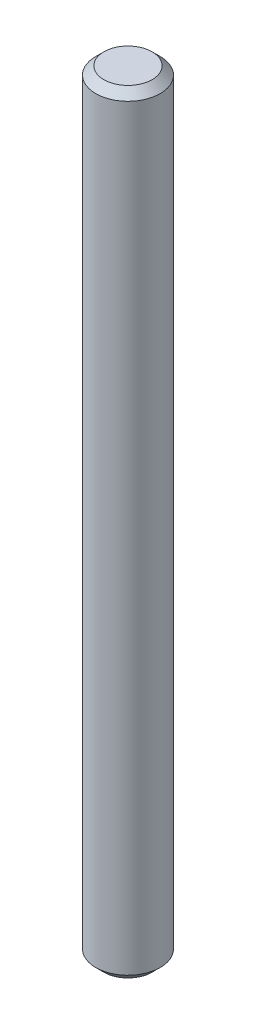
ISO-10303-21;
HEADER;
FILE_DESCRIPTION(('STEP AP214'),'2;1');
FILE_NAME('part.step','',(''),(''),'','','');
FILE_SCHEMA(('AUTOMOTIVE_DESIGN { 1 0 10303 214 1 1 1 1 }'));
ENDSEC;
DATA;
#1=APPLICATION_CONTEXT('core data for automotive mechanical design processes');
#2=APPLICATION_PROTOCOL_DEFINITION('international standard','automotive_design',2000,#1);
#3=PRODUCT_CONTEXT('',#1,'mechanical');
#4=PRODUCT('Part','Part','',(#3));
#5=PRODUCT_RELATED_PRODUCT_CATEGORY('part','',(#4));
#6=PRODUCT_DEFINITION_FORMATION('','',#4);
#7=PRODUCT_DEFINITION_CONTEXT('part definition',#1,'design');
#8=PRODUCT_DEFINITION('design','',#6,#7);
#9=PRODUCT_DEFINITION_SHAPE('','',#8);
#10=(LENGTH_UNIT() NAMED_UNIT(*) SI_UNIT(.MILLI.,.METRE.));
#11=(NAMED_UNIT(*) PLANE_ANGLE_UNIT() SI_UNIT($,.RADIAN.));
#12=(NAMED_UNIT(*) SI_UNIT($,.STERADIAN.) SOLID_ANGLE_UNIT());
#13=UNCERTAINTY_MEASURE_WITH_UNIT(LENGTH_MEASURE(1.E-05),#10,'distance_accuracy_value','');
#14=(GEOMETRIC_REPRESENTATION_CONTEXT(3) GLOBAL_UNCERTAINTY_ASSIGNED_CONTEXT((#13)) GLOBAL_UNIT_ASSIGNED_CONTEXT((#10,
#11,#12)) REPRESENTATION_CONTEXT('',''));
#15=CARTESIAN_POINT('',(0.,0.,0.));
#16=DIRECTION('',(0.,0.,1.));
#17=DIRECTION('',(1.,0.,0.));
#18=AXIS2_PLACEMENT_3D('',#15,#16,#17);
#19=CARTESIAN_POINT('',(0.,24.,0.));
#20=DIRECTION('',(0.,-1.,0.));
#21=DIRECTION('',(0.,0.,-1.));
#22=AXIS2_PLACEMENT_3D('',#19,#20,#21);
#23=CYLINDRICAL_SURFACE('',#22,2.);
#24=CARTESIAN_POINT('',(0.,-23.5,0.));
#25=DIRECTION('',(0.,1.,0.));
#26=DIRECTION('',(0.,0.,1.));
#27=AXIS2_PLACEMENT_3D('',#24,#25,#26);
#28=CIRCLE('',#27,2.);
#29=CARTESIAN_POINT('',(0.,-23.5,2.));
#30=VERTEX_POINT('',#29);
#31=EDGE_CURVE('E49',#30,#30,#28,.T.);
#32=ORIENTED_EDGE('',*,*,#31,.T.);
#33=EDGE_LOOP('',(#32));
#34=FACE_BOUND('',#33,.T.);
#35=CARTESIAN_POINT('',(0.,23.5,0.));
#36=DIRECTION('',(0.,1.,0.));
#37=DIRECTION('',(0.,0.,1.));
#38=AXIS2_PLACEMENT_3D('',#35,#36,#37);
#39=CIRCLE('',#38,2.);
#40=CARTESIAN_POINT('',(0.,23.5,2.));
#41=VERTEX_POINT('',#40);
#42=EDGE_CURVE('E53',#41,#41,#39,.F.);
#43=ORIENTED_EDGE('',*,*,#42,.T.);
#44=EDGE_LOOP('',(#43));
#45=FACE_BOUND('',#44,.T.);
#46=ADVANCED_FACE('F38',(#34,#45),#23,.T.);
#47=CARTESIAN_POINT('',(0.,24.,0.));
#48=DIRECTION('',(0.,1.,0.));
#49=DIRECTION('',(0.,0.,1.));
#50=AXIS2_PLACEMENT_3D('',#47,#48,#49);
#51=PLANE('',#50);
#52=CARTESIAN_POINT('',(0.,24.,0.));
#53=DIRECTION('',(0.,1.,0.));
#54=DIRECTION('',(0.,0.,1.));
#55=AXIS2_PLACEMENT_3D('',#52,#53,#54);
#56=CIRCLE('',#55,1.5);
#57=CARTESIAN_POINT('',(0.,24.,1.5));
#58=VERTEX_POINT('',#57);
#59=EDGE_CURVE('E10',#58,#58,#56,.T.);
#60=ORIENTED_EDGE('',*,*,#59,.T.);
#61=EDGE_LOOP('',(#60));
#62=FACE_BOUND('',#61,.T.);
#63=ADVANCED_FACE('F69',(#62),#51,.T.);
#64=CARTESIAN_POINT('',(0.,-24.,0.));
#65=DIRECTION('',(0.,1.,0.));
#66=DIRECTION('',(0.,0.,1.));
#67=AXIS2_PLACEMENT_3D('',#64,#65,#66);
#68=PLANE('',#67);
#69=CARTESIAN_POINT('',(0.,-24.,0.));
#70=DIRECTION('',(0.,1.,0.));
#71=DIRECTION('',(0.,0.,1.));
#72=AXIS2_PLACEMENT_3D('',#69,#70,#71);
#73=CIRCLE('',#72,1.50000000000001);
#74=CARTESIAN_POINT('',(0.,-24.,1.50000000000001));
#75=VERTEX_POINT('',#74);
#76=EDGE_CURVE('E45',#75,#75,#73,.F.);
#77=ORIENTED_EDGE('',*,*,#76,.T.);
#78=EDGE_LOOP('',(#77));
#79=FACE_BOUND('',#78,.T.);
#80=ADVANCED_FACE('F66',(#79),#68,.F.);
#81=CARTESIAN_POINT('',(0.,-23.5,0.));
#82=DIRECTION('',(0.,1.,0.));
#83=DIRECTION('',(0.,0.,1.));
#84=AXIS2_PLACEMENT_3D('',#81,#82,#83);
#85=CONICAL_SURFACE('',#84,2.,0.785398163397454);
#86=ORIENTED_EDGE('',*,*,#76,.F.);
#87=EDGE_LOOP('',(#86));
#88=FACE_BOUND('',#87,.T.);
#89=ORIENTED_EDGE('',*,*,#31,.F.);
#90=EDGE_LOOP('',(#89));
#91=FACE_BOUND('',#90,.T.);
#92=ADVANCED_FACE('F62',(#88,#91),#85,.T.);
#93=CARTESIAN_POINT('',(0.,24.,0.));
#94=DIRECTION('',(0.,-1.,0.));
#95=DIRECTION('',(0.,0.,-1.));
#96=AXIS2_PLACEMENT_3D('',#93,#94,#95);
#97=CONICAL_SURFACE('',#96,1.5,0.785398163397447);
#98=ORIENTED_EDGE('',*,*,#42,.F.);
#99=EDGE_LOOP('',(#98));
#100=FACE_BOUND('',#99,.T.);
#101=ORIENTED_EDGE('',*,*,#59,.F.);
#102=EDGE_LOOP('',(#101));
#103=FACE_BOUND('',#102,.T.);
#104=ADVANCED_FACE('F40',(#100,#103),#97,.T.);
#105=CLOSED_SHELL('',(#46,#63,#80,#92,#104));
#106=MANIFOLD_SOLID_BREP('B2',#105);
#107=ADVANCED_BREP_SHAPE_REPRESENTATION('',(#18,#106),#14);
#108=SHAPE_DEFINITION_REPRESENTATION(#9,#107);
ENDSEC;
END-ISO-10303-21;
